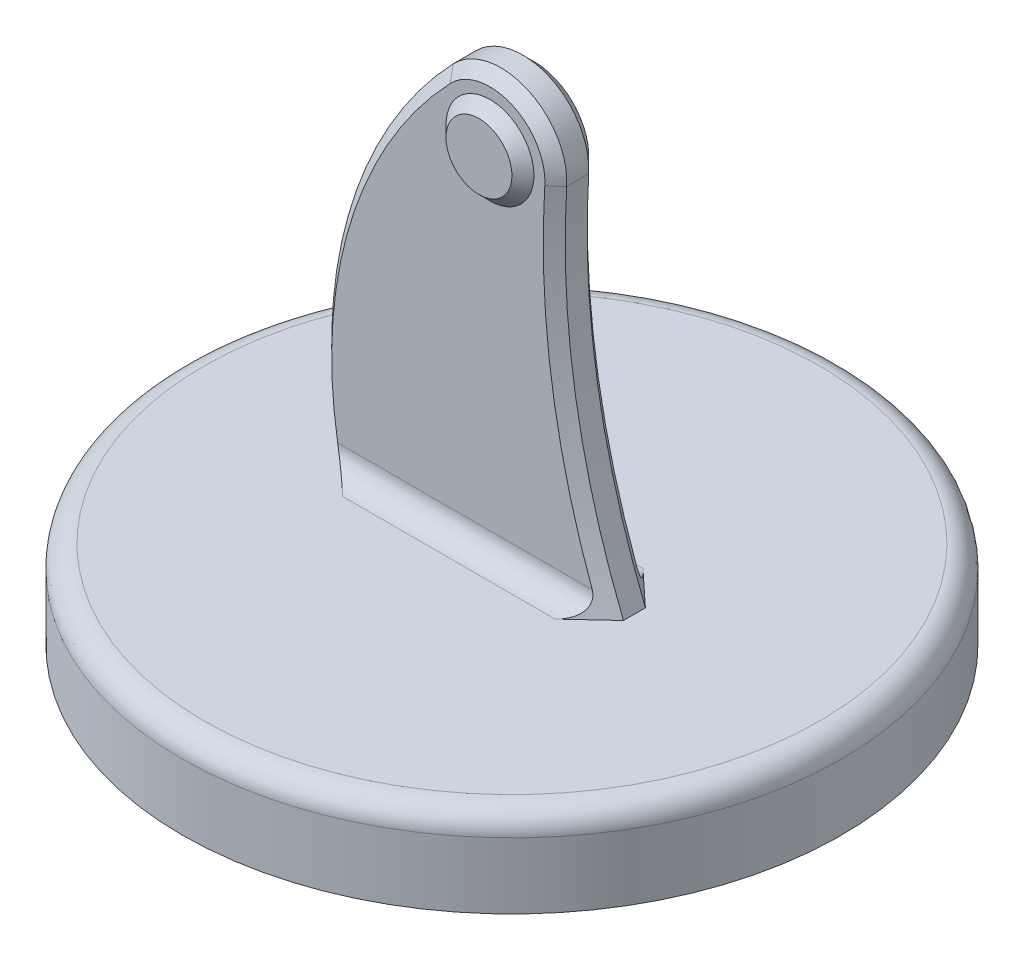
ISO-10303-21;
HEADER;
FILE_DESCRIPTION(('STEP AP214'),'2;1');
FILE_NAME('part.step','',(''),(''),'','','');
FILE_SCHEMA(('AUTOMOTIVE_DESIGN { 1 0 10303 214 1 1 1 1 }'));
ENDSEC;
DATA;
#1=APPLICATION_CONTEXT('core data for automotive mechanical design processes');
#2=APPLICATION_PROTOCOL_DEFINITION('international standard','automotive_design',2000,#1);
#3=PRODUCT_CONTEXT('',#1,'mechanical');
#4=PRODUCT('Part','Part','',(#3));
#5=PRODUCT_RELATED_PRODUCT_CATEGORY('part','',(#4));
#6=PRODUCT_DEFINITION_FORMATION('','',#4);
#7=PRODUCT_DEFINITION_CONTEXT('part definition',#1,'design');
#8=PRODUCT_DEFINITION('design','',#6,#7);
#9=PRODUCT_DEFINITION_SHAPE('','',#8);
#10=(LENGTH_UNIT() NAMED_UNIT(*) SI_UNIT(.MILLI.,.METRE.));
#11=(NAMED_UNIT(*) PLANE_ANGLE_UNIT() SI_UNIT($,.RADIAN.));
#12=(NAMED_UNIT(*) SI_UNIT($,.STERADIAN.) SOLID_ANGLE_UNIT());
#13=UNCERTAINTY_MEASURE_WITH_UNIT(LENGTH_MEASURE(1.E-05),#10,'distance_accuracy_value','');
#14=(GEOMETRIC_REPRESENTATION_CONTEXT(3) GLOBAL_UNCERTAINTY_ASSIGNED_CONTEXT((#13)) GLOBAL_UNIT_ASSIGNED_CONTEXT((#10,
#11,#12)) REPRESENTATION_CONTEXT('',''));
#15=CARTESIAN_POINT('',(0.,0.,0.));
#16=DIRECTION('',(0.,0.,1.));
#17=DIRECTION('',(1.,0.,0.));
#18=AXIS2_PLACEMENT_3D('',#15,#16,#17);
#19=CARTESIAN_POINT('',(0.,20.,0.));
#20=DIRECTION('',(0.,1.,0.));
#21=DIRECTION('',(0.,0.,1.));
#22=AXIS2_PLACEMENT_3D('',#19,#20,#21);
#23=PLANE('',#22);
#24=CARTESIAN_POINT('',(0.,20.,0.));
#25=DIRECTION('',(0.,1.,0.));
#26=DIRECTION('',(0.,0.,1.));
#27=AXIS2_PLACEMENT_3D('',#24,#25,#26);
#28=CIRCLE('',#27,70.);
#29=CARTESIAN_POINT('',(0.,20.,70.));
#30=VERTEX_POINT('',#29);
#31=EDGE_CURVE('E340',#30,#30,#28,.T.);
#32=ORIENTED_EDGE('',*,*,#31,.T.);
#33=EDGE_LOOP('',(#32));
#34=FACE_BOUND('',#33,.T.);
#35=DIRECTION('',(-1.,0.,0.));
#36=VECTOR('',#35,1.);
#37=CARTESIAN_POINT('',(0.,20.,10.));
#38=LINE('',#37,#36);
#39=CARTESIAN_POINT('',(19.8084097202195,20.,10.));
#40=VERTEX_POINT('',#39);
#41=CARTESIAN_POINT('',(-28.5347400447897,20.,10.));
#42=VERTEX_POINT('',#41);
#43=EDGE_CURVE('E303',#40,#42,#38,.T.);
#44=ORIENTED_EDGE('',*,*,#43,.T.);
#45=CARTESIAN_POINT('',(-28.5347400447897,20.,9.99999999999999));
#46=CARTESIAN_POINT('',(-29.3904619495379,20.,9.1672779060872));
#47=CARTESIAN_POINT('',(-30.2458713230867,20.,8.33423473892486));
#48=CARTESIAN_POINT('',(-31.9561089872226,20.,6.6675526869515));
#49=CARTESIAN_POINT('',(-32.8109372780003,20.,5.83391380233608));
#50=CARTESIAN_POINT('',(-34.5191891841924,20.,4.16693335697089));
#51=CARTESIAN_POINT('',(-35.372613344394,20.,3.33359235450618));
#52=CARTESIAN_POINT('',(-36.2257918410724,20.,2.49999999999994));
#53=B_SPLINE_CURVE_WITH_KNOTS('',3,(#45,#46,#47,#48,#49,#50,#51,#52),.UNSPECIFIED.,.F.,.F.,(4,2,
2,4),(0.,3.58206271115793,7.16412424671795,10.7425468249187),.UNSPECIFIED.);
#54=CARTESIAN_POINT('',(-36.2257918410724,20.,2.49999999999994));
#55=VERTEX_POINT('',#54);
#56=EDGE_CURVE('E203',#42,#55,#53,.T.);
#57=ORIENTED_EDGE('',*,*,#56,.T.);
#58=DIRECTION('',(0.,0.,-1.));
#59=VECTOR('',#58,1.);
#60=CARTESIAN_POINT('',(-36.2257918410724,20.,5.));
#61=LINE('',#60,#59);
#62=CARTESIAN_POINT('',(-36.2257918410724,20.,-2.5));
#63=VERTEX_POINT('',#62);
#64=EDGE_CURVE('E158',#55,#63,#61,.T.);
#65=ORIENTED_EDGE('',*,*,#64,.T.);
#66=CARTESIAN_POINT('',(-36.2257918410724,20.,-2.5));
#67=CARTESIAN_POINT('',(-35.372613344394,20.,-3.33359235450621));
#68=CARTESIAN_POINT('',(-34.5191891841924,20.,-4.16693335697091));
#69=CARTESIAN_POINT('',(-32.810937278002,20.,-5.83391380233447));
#70=CARTESIAN_POINT('',(-31.9561089872259,20.,-6.66755268694829));
#71=CARTESIAN_POINT('',(-30.2458713230933,20.,-8.33423473891845));
#72=CARTESIAN_POINT('',(-29.3904619495461,20.,-9.16727790607919));
#73=CARTESIAN_POINT('',(-28.5347400447996,20.,-9.99999999999037));
#74=B_SPLINE_CURVE_WITH_KNOTS('',3,(#66,#67,#68,#69,#70,#71,#72,#73),.UNSPECIFIED.,.F.,.F.,(4,2,
2,4),(0.,3.57842257820069,7.16048411375383,10.7425468249049),.UNSPECIFIED.);
#75=CARTESIAN_POINT('',(-28.5347400447996,20.,-10.));
#76=VERTEX_POINT('',#75);
#77=EDGE_CURVE('E235',#63,#76,#74,.T.);
#78=ORIENTED_EDGE('',*,*,#77,.T.);
#79=DIRECTION('',(-1.,0.,0.));
#80=VECTOR('',#79,1.);
#81=CARTESIAN_POINT('',(25.1824752050036,20.,-10.));
#82=LINE('',#81,#80);
#83=CARTESIAN_POINT('',(19.8084097202196,20.,-10.));
#84=VERTEX_POINT('',#83);
#85=EDGE_CURVE('E309',#76,#84,#82,.F.);
#86=ORIENTED_EDGE('',*,*,#85,.T.);
#87=CARTESIAN_POINT('',(19.8084097202196,20.,-10.));
#88=CARTESIAN_POINT('',(20.7032286114694,20.,-9.16574365323036));
#89=CARTESIAN_POINT('',(21.5984643871197,20.,-8.33193432974239));
#90=CARTESIAN_POINT('',(23.3898068938444,20.,-6.6652533617684));
#91=CARTESIAN_POINT('',(24.2859136241593,20.,-5.83238171646611));
#92=CARTESIAN_POINT('',(26.0805990637617,20.,-4.16616784041949));
#93=CARTESIAN_POINT('',(26.979179359604,20.,-3.33282731858594));
#94=CARTESIAN_POINT('',(27.8782351753599,20.,-2.5));
#95=B_SPLINE_CURVE_WITH_KNOTS('',3,(#87,#88,#89,#90,#91,#92,#93,#94),.UNSPECIFIED.,.F.,.F.,(4,2,
2,4),(0.,3.67017170974666,7.34034022201679,11.0169040821688),.UNSPECIFIED.);
#96=CARTESIAN_POINT('',(27.8782351753599,20.,-2.5));
#97=VERTEX_POINT('',#96);
#98=EDGE_CURVE('E228',#84,#97,#95,.T.);
#99=ORIENTED_EDGE('',*,*,#98,.T.);
#100=DIRECTION('',(0.,0.,-1.));
#101=VECTOR('',#100,1.);
#102=CARTESIAN_POINT('',(27.8782351753599,20.,5.));
#103=LINE('',#102,#101);
#104=CARTESIAN_POINT('',(27.8782351753599,20.,2.49999999999994));
#105=VERTEX_POINT('',#104);
#106=EDGE_CURVE('E164',#97,#105,#103,.F.);
#107=ORIENTED_EDGE('',*,*,#106,.T.);
#108=CARTESIAN_POINT('',(27.8782351753599,20.,2.49999999999994));
#109=CARTESIAN_POINT('',(26.979179359604,20.,3.33282731858591));
#110=CARTESIAN_POINT('',(26.0805990637617,20.,4.16616784041948));
#111=CARTESIAN_POINT('',(24.2859136241593,20.,5.83238171646611));
#112=CARTESIAN_POINT('',(23.3898068938443,20.,6.6652533617684));
#113=CARTESIAN_POINT('',(21.5984643871197,20.,8.33193432974239));
#114=CARTESIAN_POINT('',(20.7032286114694,20.,9.16574365323037));
#115=CARTESIAN_POINT('',(19.8084097202195,20.,10.));
#116=B_SPLINE_CURVE_WITH_KNOTS('',3,(#108,#109,#110,#111,#112,#113,#114,#115),.UNSPECIFIED.,.F.,
.F.,(4,2,2,4),(0.,3.67656386015208,7.34673237242222,11.0169040821689),.UNSPECIFIED.);
#117=EDGE_CURVE('E194',#105,#40,#116,.T.);
#118=ORIENTED_EDGE('',*,*,#117,.T.);
#119=EDGE_LOOP('',(#44,#57,#65,#78,#86,#99,#107,#118));
#120=FACE_BOUND('',#119,.T.);
#121=ADVANCED_FACE('F45',(#34,#120),#23,.T.);
#122=CARTESIAN_POINT('',(0.,20.,0.));
#123=DIRECTION('',(0.,-1.,0.));
#124=DIRECTION('',(0.,0.,-1.));
#125=AXIS2_PLACEMENT_3D('',#122,#123,#124);
#126=CYLINDRICAL_SURFACE('',#125,75.);
#127=CARTESIAN_POINT('',(0.,15.,0.));
#128=DIRECTION('',(0.,1.,0.));
#129=DIRECTION('',(0.,0.,1.));
#130=AXIS2_PLACEMENT_3D('',#127,#128,#129);
#131=CIRCLE('',#130,75.);
#132=CARTESIAN_POINT('',(0.,15.,75.));
#133=VERTEX_POINT('',#132);
#134=EDGE_CURVE('E344',#133,#133,#131,.F.);
#135=ORIENTED_EDGE('',*,*,#134,.T.);
#136=EDGE_LOOP('',(#135));
#137=FACE_BOUND('',#136,.T.);
#138=CARTESIAN_POINT('',(0.,0.,0.));
#139=DIRECTION('',(0.,1.,0.));
#140=DIRECTION('',(0.,0.,1.));
#141=AXIS2_PLACEMENT_3D('',#138,#139,#140);
#142=CIRCLE('',#141,75.);
#143=CARTESIAN_POINT('',(0.,0.,75.));
#144=VERTEX_POINT('',#143);
#145=EDGE_CURVE('E331',#144,#144,#142,.T.);
#146=ORIENTED_EDGE('',*,*,#145,.T.);
#147=EDGE_LOOP('',(#146));
#148=FACE_BOUND('',#147,.T.);
#149=ADVANCED_FACE('F218',(#137,#148),#126,.T.);
#150=CARTESIAN_POINT('',(0.,0.,0.));
#151=DIRECTION('',(0.,1.,0.));
#152=DIRECTION('',(0.,0.,1.));
#153=AXIS2_PLACEMENT_3D('',#150,#151,#152);
#154=PLANE('',#153);
#155=ORIENTED_EDGE('',*,*,#145,.F.);
#156=EDGE_LOOP('',(#155));
#157=FACE_BOUND('',#156,.T.);
#158=ADVANCED_FACE('F222',(#157),#154,.F.);
#159=CARTESIAN_POINT('',(0.,15.,0.));
#160=DIRECTION('',(0.,1.,0.));
#161=DIRECTION('',(0.,0.,1.));
#162=AXIS2_PLACEMENT_3D('',#159,#160,#161);
#163=TOROIDAL_SURFACE('',#162,70.,5.);
#164=ORIENTED_EDGE('',*,*,#134,.F.);
#165=EDGE_LOOP('',(#164));
#166=FACE_BOUND('',#165,.T.);
#167=ORIENTED_EDGE('',*,*,#31,.F.);
#168=EDGE_LOOP('',(#167));
#169=FACE_BOUND('',#168,.T.);
#170=ADVANCED_FACE('F386',(#166,#169),#163,.T.);
#171=CARTESIAN_POINT('',(61.4788080980091,41.3028437243492,5.));
#172=DIRECTION('',(0.,0.,-1.));
#173=DIRECTION('',(-1.,0.,0.));
#174=AXIS2_PLACEMENT_3D('',#171,#172,#173);
#175=CYLINDRICAL_SURFACE('',#174,100.);
#176=ORIENTED_EDGE('',*,*,#64,.F.);
#177=CARTESIAN_POINT('',(61.4788080980091,41.3028437243492,2.49999999999994));
#178=DIRECTION('',(0.,0.,-1.));
#179=DIRECTION('',(-1.,0.,0.));
#180=AXIS2_PLACEMENT_3D('',#177,#178,#179);
#181=CIRCLE('',#180,100.);
#182=CARTESIAN_POINT('',(-10.8492014290605,110.358321695703,2.49999999999994));
#183=VERTEX_POINT('',#182);
#184=EDGE_CURVE('E176',#55,#183,#181,.T.);
#185=ORIENTED_EDGE('',*,*,#184,.T.);
#186=DIRECTION('',(0.,0.,-1.));
#187=VECTOR('',#186,1.);
#188=CARTESIAN_POINT('',(-10.8492014290605,110.358321695703,5.));
#189=LINE('',#188,#187);
#190=CARTESIAN_POINT('',(-10.8492014290605,110.358321695703,-2.5));
#191=VERTEX_POINT('',#190);
#192=EDGE_CURVE('E321',#183,#191,#189,.T.);
#193=ORIENTED_EDGE('',*,*,#192,.T.);
#194=CARTESIAN_POINT('',(61.4788080980091,41.3028437243492,-2.5));
#195=DIRECTION('',(0.,0.,-1.));
#196=DIRECTION('',(-1.,0.,0.));
#197=AXIS2_PLACEMENT_3D('',#194,#195,#196);
#198=CIRCLE('',#197,100.);
#199=EDGE_CURVE('E173',#191,#63,#198,.F.);
#200=ORIENTED_EDGE('',*,*,#199,.T.);
#201=EDGE_LOOP('',(#176,#185,#193,#200));
#202=FACE_BOUND('',#201,.T.);
#203=ADVANCED_FACE('F220',(#202),#175,.T.);
#204=CARTESIAN_POINT('',(194.618391581677,87.8064911464742,5.));
#205=DIRECTION('',(0.,0.,-1.));
#206=DIRECTION('',(-1.,0.,0.));
#207=AXIS2_PLACEMENT_3D('',#204,#205,#206);
#208=CYLINDRICAL_SURFACE('',#207,180.);
#209=DIRECTION('',(0.,0.,-1.));
#210=VECTOR('',#209,1.);
#211=CARTESIAN_POINT('',(14.9706455062829,99.062037780498,5.));
#212=LINE('',#211,#210);
#213=CARTESIAN_POINT('',(14.9706455062829,99.062037780498,2.49999999999994));
#214=VERTEX_POINT('',#213);
#215=CARTESIAN_POINT('',(14.9706455062829,99.062037780498,-2.5));
#216=VERTEX_POINT('',#215);
#217=EDGE_CURVE('E324',#214,#216,#212,.T.);
#218=ORIENTED_EDGE('',*,*,#217,.F.);
#219=CARTESIAN_POINT('',(194.618391581677,87.8064911464742,2.49999999999994));
#220=DIRECTION('',(0.,0.,-1.));
#221=DIRECTION('',(-1.,0.,0.));
#222=AXIS2_PLACEMENT_3D('',#219,#220,#221);
#223=CIRCLE('',#222,180.);
#224=EDGE_CURVE('E147',#214,#105,#223,.F.);
#225=ORIENTED_EDGE('',*,*,#224,.T.);
#226=ORIENTED_EDGE('',*,*,#106,.F.);
#227=CARTESIAN_POINT('',(194.618391581677,87.8064911464742,-2.5));
#228=DIRECTION('',(0.,0.,-1.));
#229=DIRECTION('',(-1.,0.,0.));
#230=AXIS2_PLACEMENT_3D('',#227,#228,#229);
#231=CIRCLE('',#230,180.);
#232=EDGE_CURVE('E139',#97,#216,#231,.T.);
#233=ORIENTED_EDGE('',*,*,#232,.T.);
#234=EDGE_LOOP('',(#218,#225,#226,#233));
#235=FACE_BOUND('',#234,.T.);
#236=ADVANCED_FACE('F354',(#235),#208,.F.);
#237=CARTESIAN_POINT('',(0.,100.,5.));
#238=DIRECTION('',(0.,0.,-1.));
#239=DIRECTION('',(-1.,0.,0.));
#240=AXIS2_PLACEMENT_3D('',#237,#238,#239);
#241=CYLINDRICAL_SURFACE('',#240,15.);
#242=ORIENTED_EDGE('',*,*,#192,.F.);
#243=CARTESIAN_POINT('',(0.,100.,2.49999999999994));
#244=DIRECTION('',(0.,0.,-1.));
#245=DIRECTION('',(-1.,0.,0.));
#246=AXIS2_PLACEMENT_3D('',#243,#244,#245);
#247=CIRCLE('',#246,15.);
#248=EDGE_CURVE('E182',#183,#214,#247,.T.);
#249=ORIENTED_EDGE('',*,*,#248,.T.);
#250=ORIENTED_EDGE('',*,*,#217,.T.);
#251=CARTESIAN_POINT('',(0.,100.,-2.5));
#252=DIRECTION('',(0.,0.,-1.));
#253=DIRECTION('',(-1.,0.,0.));
#254=AXIS2_PLACEMENT_3D('',#251,#252,#253);
#255=CIRCLE('',#254,15.);
#256=EDGE_CURVE('E179',#216,#191,#255,.F.);
#257=ORIENTED_EDGE('',*,*,#256,.T.);
#258=EDGE_LOOP('',(#242,#249,#250,#257));
#259=FACE_BOUND('',#258,.T.);
#260=ADVANCED_FACE('F361',(#259),#241,.T.);
#261=CARTESIAN_POINT('',(61.4788080980091,41.3028437243492,5.));
#262=DIRECTION('',(0.,0.,-1.));
#263=DIRECTION('',(-1.,0.,0.));
#264=AXIS2_PLACEMENT_3D('',#261,#262,#263);
#265=PLANE('',#264);
#266=CARTESIAN_POINT('',(0.,100.,5.));
#267=DIRECTION('',(0.,0.,-1.));
#268=DIRECTION('',(-1.,0.,0.));
#269=AXIS2_PLACEMENT_3D('',#266,#267,#268);
#270=CIRCLE('',#269,10.);
#271=CARTESIAN_POINT('',(-10.,100.,5.));
#272=VERTEX_POINT('',#271);
#273=EDGE_CURVE('E55',#272,#272,#270,.F.);
#274=ORIENTED_EDGE('',*,*,#273,.F.);
#275=EDGE_LOOP('',(#274));
#276=FACE_BOUND('',#275,.T.);
#277=CARTESIAN_POINT('',(61.4788080980091,41.3028437243492,5.));
#278=DIRECTION('',(0.,0.,-1.));
#279=DIRECTION('',(-1.,0.,0.));
#280=AXIS2_PLACEMENT_3D('',#277,#278,#279);
#281=CIRCLE('',#280,97.5);
#282=CARTESIAN_POINT('',(-9.04100119088368,108.631934746419,5.));
#283=VERTEX_POINT('',#282);
#284=CARTESIAN_POINT('',(-34.6485412178825,25.,5.));
#285=VERTEX_POINT('',#284);
#286=EDGE_CURVE('E140',#283,#285,#281,.F.);
#287=ORIENTED_EDGE('',*,*,#286,.T.);
#288=DIRECTION('',(-1.,0.,0.));
#289=VECTOR('',#288,1.);
#290=CARTESIAN_POINT('',(61.4788080980091,25.,5.));
#291=LINE('',#290,#289);
#292=CARTESIAN_POINT('',(23.2661384016624,25.,5.));
#293=VERTEX_POINT('',#292);
#294=EDGE_CURVE('E134',#285,#293,#291,.F.);
#295=ORIENTED_EDGE('',*,*,#294,.T.);
#296=CARTESIAN_POINT('',(194.618391581677,87.8064911464742,5.));
#297=DIRECTION('',(0.,0.,-1.));
#298=DIRECTION('',(-1.,0.,0.));
#299=AXIS2_PLACEMENT_3D('',#296,#297,#298);
#300=CIRCLE('',#299,182.5);
#301=CARTESIAN_POINT('',(12.4755379219024,99.2183648170816,5.));
#302=VERTEX_POINT('',#301);
#303=EDGE_CURVE('E126',#293,#302,#300,.T.);
#304=ORIENTED_EDGE('',*,*,#303,.T.);
#305=CARTESIAN_POINT('',(0.,100.,5.));
#306=DIRECTION('',(0.,0.,-1.));
#307=DIRECTION('',(-1.,0.,0.));
#308=AXIS2_PLACEMENT_3D('',#305,#306,#307);
#309=CIRCLE('',#308,12.5);
#310=EDGE_CURVE('E131',#302,#283,#309,.F.);
#311=ORIENTED_EDGE('',*,*,#310,.T.);
#312=EDGE_LOOP('',(#287,#295,#304,#311));
#313=FACE_BOUND('',#312,.T.);
#314=ADVANCED_FACE('F129',(#276,#313),#265,.F.);
#315=CARTESIAN_POINT('',(61.4788080980091,41.3028437243492,-5.));
#316=DIRECTION('',(0.,0.,-1.));
#317=DIRECTION('',(-1.,0.,0.));
#318=AXIS2_PLACEMENT_3D('',#315,#316,#317);
#319=PLANE('',#318);
#320=CARTESIAN_POINT('',(0.,100.,-5.));
#321=DIRECTION('',(0.,0.,-1.));
#322=DIRECTION('',(-1.,0.,0.));
#323=AXIS2_PLACEMENT_3D('',#320,#321,#322);
#324=CIRCLE('',#323,5.);
#325=CARTESIAN_POINT('',(-5.,100.,-5.));
#326=VERTEX_POINT('',#325);
#327=EDGE_CURVE('E334',#326,#326,#324,.T.);
#328=ORIENTED_EDGE('',*,*,#327,.F.);
#329=EDGE_LOOP('',(#328));
#330=FACE_BOUND('',#329,.T.);
#331=CARTESIAN_POINT('',(194.618391581677,87.8064911464742,-5.));
#332=DIRECTION('',(0.,0.,-1.));
#333=DIRECTION('',(-1.,0.,0.));
#334=AXIS2_PLACEMENT_3D('',#331,#332,#333);
#335=CIRCLE('',#334,182.5);
#336=CARTESIAN_POINT('',(12.4755379219024,99.2183648170816,-5.));
#337=VERTEX_POINT('',#336);
#338=CARTESIAN_POINT('',(23.2661384016624,25.,-5.));
#339=VERTEX_POINT('',#338);
#340=EDGE_CURVE('E191',#337,#339,#335,.F.);
#341=ORIENTED_EDGE('',*,*,#340,.T.);
#342=DIRECTION('',(-1.,0.,0.));
#343=VECTOR('',#342,1.);
#344=CARTESIAN_POINT('',(-33.6654972978261,25.,-5.));
#345=LINE('',#344,#343);
#346=CARTESIAN_POINT('',(-34.6485412178826,25.,-5.));
#347=VERTEX_POINT('',#346);
#348=EDGE_CURVE('E296',#339,#347,#345,.T.);
#349=ORIENTED_EDGE('',*,*,#348,.T.);
#350=CARTESIAN_POINT('',(61.4788080980091,41.3028437243492,-5.));
#351=DIRECTION('',(0.,0.,-1.));
#352=DIRECTION('',(-1.,0.,0.));
#353=AXIS2_PLACEMENT_3D('',#350,#351,#352);
#354=CIRCLE('',#353,97.5);
#355=CARTESIAN_POINT('',(-9.0410011908837,108.631934746419,-5.));
#356=VERTEX_POINT('',#355);
#357=EDGE_CURVE('E185',#347,#356,#354,.T.);
#358=ORIENTED_EDGE('',*,*,#357,.T.);
#359=CARTESIAN_POINT('',(0.,100.,-5.));
#360=DIRECTION('',(0.,0.,-1.));
#361=DIRECTION('',(-1.,0.,0.));
#362=AXIS2_PLACEMENT_3D('',#359,#360,#361);
#363=CIRCLE('',#362,12.5);
#364=EDGE_CURVE('E188',#356,#337,#363,.T.);
#365=ORIENTED_EDGE('',*,*,#364,.T.);
#366=EDGE_LOOP('',(#341,#349,#358,#365));
#367=FACE_BOUND('',#366,.T.);
#368=ADVANCED_FACE('F368',(#330,#367),#319,.T.);
#369=CARTESIAN_POINT('',(61.4788080980091,41.3028437243492,5.));
#370=DIRECTION('',(0.,0.,-1.));
#371=DIRECTION('',(-1.,0.,0.));
#372=AXIS2_PLACEMENT_3D('',#369,#370,#371);
#373=CONICAL_SURFACE('',#372,97.5,0.785398163397443);
#374=ORIENTED_EDGE('',*,*,#56,.F.);
#375=CARTESIAN_POINT('',(-28.5347400447897,20.,10.));
#376=CARTESIAN_POINT('',(-28.6394037298975,20.000005434771,9.89815059591553));
#377=CARTESIAN_POINT('',(-28.7444044701097,20.0031117141702,9.79667872726323));
#378=CARTESIAN_POINT('',(-28.9548959740975,20.015430758412,9.59462953884507));
#379=CARTESIAN_POINT('',(-29.06038670815,20.0246431575365,9.49405216587014));
#380=CARTESIAN_POINT('',(-29.3774210581305,20.0613070700192,9.19377282554195));
#381=CARTESIAN_POINT('',(-29.5894429565536,20.0977851443199,8.99560518423251));
#382=CARTESIAN_POINT('',(-30.0149470348641,20.1948303369437,8.60300164617535));
#383=CARTESIAN_POINT('',(-30.2284255574994,20.2556075268316,8.40861421626865));
#384=CARTESIAN_POINT('',(-30.6533009098754,20.4012836398836,8.02679361368094));
#385=CARTESIAN_POINT('',(-30.8646984190369,20.486174400497,7.83935811197359));
#386=CARTESIAN_POINT('',(-31.2358180513899,20.6583962515183,7.51482560986986));
#387=CARTESIAN_POINT('',(-31.3963375276233,20.7407622681903,7.37599142315452));
#388=CARTESIAN_POINT('',(-31.7140120771384,20.920552010497,7.10437811445689));
#389=CARTESIAN_POINT('',(-31.8711678474207,21.0179725815724,6.97159773148074));
#390=CARTESIAN_POINT('',(-32.1804856522051,21.2281280967814,6.71357483416337));
#391=CARTESIAN_POINT('',(-32.3326604747659,21.340819251485,6.58831219251085));
#392=CARTESIAN_POINT('',(-32.6308687242772,21.5823060586908,6.34643164579909));
#393=CARTESIAN_POINT('',(-32.7769045910204,21.7110952309635,6.22981029212435));
#394=CARTESIAN_POINT('',(-33.1114401131507,22.0342782323158,5.96739519381318));
#395=CARTESIAN_POINT('',(-33.2966353855766,22.2357416578196,5.82592043060814));
#396=CARTESIAN_POINT('',(-33.6456704142065,22.6710303913349,5.5683239835165));
#397=CARTESIAN_POINT('',(-33.8095301722191,22.9048249589202,5.45217848375558));
#398=CARTESIAN_POINT('',(-34.0707148956103,23.3443131711605,5.27769119806797));
#399=CARTESIAN_POINT('',(-34.1745553911898,23.5431850809405,5.21216424392805));
#400=CARTESIAN_POINT('',(-34.3129103192239,23.8535368517304,5.13204069721148));
#401=CARTESIAN_POINT('',(-34.3560939901829,23.9588861391615,5.10837492195165));
#402=CARTESIAN_POINT('',(-34.4360284136755,24.1732140859586,5.06762637880011));
#403=CARTESIAN_POINT('',(-34.4727823057824,24.2821909429161,5.05054039316327));
#404=CARTESIAN_POINT('',(-34.535756379972,24.4918108462674,5.02489103654147));
#405=CARTESIAN_POINT('',(-34.5626708259066,24.5921598661022,5.01563242611837));
#406=CARTESIAN_POINT('',(-34.6103490298529,24.7948018697914,5.00317605161259));
#407=CARTESIAN_POINT('',(-34.6311052843733,24.8970970648735,4.99998565599897));
#408=CARTESIAN_POINT('',(-34.6485412178825,25.,5.));
#409=B_SPLINE_CURVE_WITH_KNOTS('',3,(#375,#376,#377,#378,#379,#380,#381,#382,#383,#384,#385,
#386,#387,#388,#389,#390,#391,#392,#393,#394,#395,#396,#397,#398,#399,#400,#401,#402,#403,#404,
#405,#406,#407,#408),.UNSPECIFIED.,.F.,.F.,(4,2,2,2,2,2,2,2,2,2,2,2,2,2,2,2,4),(0.,
0.438046358396577,0.876066482945869,1.7524565435902,2.63659295844549,3.52043044513257,
4.20284499036563,4.88511673460729,5.5654718630622,6.24555399245983,7.1667857113255,
8.08714747013587,8.78553853656554,9.13405477040997,9.48240035064392,9.79495848648627,
10.1078959115209),.UNSPECIFIED.);
#410=EDGE_CURVE('E281',#42,#285,#409,.T.);
#411=ORIENTED_EDGE('',*,*,#410,.T.);
#412=ORIENTED_EDGE('',*,*,#286,.F.);
#413=DIRECTION('',(0.511436260063155,-0.488295967516219,0.707106781186556));
#414=VECTOR('',#413,1.);
#415=CARTESIAN_POINT('',(-10.8492014290604,110.358321695703,2.49999999999994));
#416=LINE('',#415,#414);
#417=EDGE_CURVE('E151',#183,#283,#416,.T.);
#418=ORIENTED_EDGE('',*,*,#417,.F.);
#419=ORIENTED_EDGE('',*,*,#184,.F.);
#420=EDGE_LOOP('',(#374,#411,#412,#418,#419));
#421=FACE_BOUND('',#420,.T.);
#422=ADVANCED_FACE('F252',(#421),#373,.T.);
#423=CARTESIAN_POINT('',(0.,100.,5.));
#424=DIRECTION('',(0.,0.,-1.));
#425=DIRECTION('',(-1.,0.,0.));
#426=AXIS2_PLACEMENT_3D('',#423,#424,#425);
#427=CONICAL_SURFACE('',#426,12.5,0.785398163397445);
#428=ORIENTED_EDGE('',*,*,#417,.T.);
#429=ORIENTED_EDGE('',*,*,#310,.F.);
#430=DIRECTION('',(-0.705722997082166,0.0442159630604418,0.70710678118655));
#431=VECTOR('',#430,1.);
#432=CARTESIAN_POINT('',(14.9706455062829,99.062037780498,2.49999999999994));
#433=LINE('',#432,#431);
#434=EDGE_CURVE('E144',#214,#302,#433,.T.);
#435=ORIENTED_EDGE('',*,*,#434,.F.);
#436=ORIENTED_EDGE('',*,*,#248,.F.);
#437=EDGE_LOOP('',(#428,#429,#435,#436));
#438=FACE_BOUND('',#437,.T.);
#439=ADVANCED_FACE('F155',(#438),#427,.T.);
#440=CARTESIAN_POINT('',(194.618391581677,87.8064911464742,5.));
#441=DIRECTION('',(0.,0.,1.));
#442=DIRECTION('',(1.,0.,0.));
#443=AXIS2_PLACEMENT_3D('',#440,#441,#442);
#444=CONICAL_SURFACE('',#443,182.5,0.785398163397448);
#445=ORIENTED_EDGE('',*,*,#117,.F.);
#446=ORIENTED_EDGE('',*,*,#224,.F.);
#447=ORIENTED_EDGE('',*,*,#434,.T.);
#448=ORIENTED_EDGE('',*,*,#303,.F.);
#449=CARTESIAN_POINT('',(23.2661384016624,25.,5.));
#450=CARTESIAN_POINT('',(23.3002005671833,24.9070970588888,4.99998982101167));
#451=CARTESIAN_POINT('',(23.3319003658589,24.8132947634358,5.00258916549921));
#452=CARTESIAN_POINT('',(23.3901604515582,24.6243431264429,5.01323591479231));
#453=CARTESIAN_POINT('',(23.4167170425787,24.5291928685387,5.02128721893148));
#454=CARTESIAN_POINT('',(23.4642590261444,24.3379983044757,5.04308274610182));
#455=CARTESIAN_POINT('',(23.4852365999852,24.2419529368185,5.05683489026829));
#456=CARTESIAN_POINT('',(23.5211837982653,24.0497650147842,5.09015681555102));
#457=CARTESIAN_POINT('',(23.5361548951619,23.9536224900254,5.10972516880294));
#458=CARTESIAN_POINT('',(23.5598434730769,23.7615087850931,5.15480488443815));
#459=CARTESIAN_POINT('',(23.5685335526405,23.6655401561134,5.18034165170114));
#460=CARTESIAN_POINT('',(23.579358971121,23.4749236099918,5.23722376580067));
#461=CARTESIAN_POINT('',(23.5814919758389,23.3802761751035,5.26857117691084));
#462=CARTESIAN_POINT('',(23.5791344482645,23.1932936963799,5.33677201100208));
#463=CARTESIAN_POINT('',(23.5746576512134,23.1009542616796,5.37361387353918));
#464=CARTESIAN_POINT('',(23.5591775223305,22.919061246429,5.45252524641229));
#465=CARTESIAN_POINT('',(23.5481717304809,22.8295087293356,5.49459672245526));
#466=CARTESIAN_POINT('',(23.520532895729,22.6581681393704,5.58133674973435));
#467=CARTESIAN_POINT('',(23.5042028834637,22.5762147571267,5.62577615786903));
#468=CARTESIAN_POINT('',(23.466096025912,22.4158463901558,5.71855815688245));
#469=CARTESIAN_POINT('',(23.444317399856,22.3374325721739,5.76690202034877));
#470=CARTESIAN_POINT('',(23.3712669897884,22.1079558946016,5.91717329223245));
#471=CARTESIAN_POINT('',(23.3122859316015,21.9626892734793,6.02432427062643));
#472=CARTESIAN_POINT('',(23.151924605642,21.6389242665395,6.29030441266747));
#473=CARTESIAN_POINT('',(23.0429297160745,21.4679275550975,6.45361876347933));
#474=CARTESIAN_POINT('',(22.8002588719763,21.1580788280493,6.79181102146745));
#475=CARTESIAN_POINT('',(22.6665421365392,21.0192807927284,6.96670772427775));
#476=CARTESIAN_POINT('',(22.319763824735,20.7186526437609,7.39885475877629));
#477=CARTESIAN_POINT('',(22.0972299147782,20.5723698914755,7.65932857124398));
#478=CARTESIAN_POINT('',(21.7458214725293,20.3928428518393,8.05194856088024));
#479=CARTESIAN_POINT('',(21.6254999159944,20.3395856596789,8.18339715955419));
#480=CARTESIAN_POINT('',(21.380034828669,20.2454846645251,8.44627656448095));
#481=CARTESIAN_POINT('',(21.2548922835545,20.2046383390843,8.57770736891519));
#482=CARTESIAN_POINT('',(21.0216039690425,20.1402893934769,8.81843555286566));
#483=CARTESIAN_POINT('',(20.9140295433623,20.115042165326,8.92783397103434));
#484=CARTESIAN_POINT('',(20.6966536902156,20.0722321318853,9.14592246129715));
#485=CARTESIAN_POINT('',(20.5868522553934,20.0546693519809,9.25461253105011));
#486=CARTESIAN_POINT('',(20.3664141647906,20.0269838470988,9.47008454014683));
#487=CARTESIAN_POINT('',(20.2557937252113,20.0167960789621,9.57687485159776));
#488=CARTESIAN_POINT('',(20.0331107499653,20.0033093732439,9.78932326315866));
#489=CARTESIAN_POINT('',(19.9210486204085,20.0000085366556,9.89498166738485));
#490=CARTESIAN_POINT('',(19.8084097202195,20.,10.));
#491=B_SPLINE_CURVE_WITH_KNOTS('',3,(#449,#450,#451,#452,#453,#454,#455,#456,#457,#458,#459,
#460,#461,#462,#463,#464,#465,#466,#467,#468,#469,#470,#471,#472,#473,#474,#475,#476,#477,#478,
#479,#480,#481,#482,#483,#484,#485,#486,#487,#488,#489,#490),.UNSPECIFIED.,.F.,.F.,(4,2,2,2,2,2,
2,2,2,2,2,2,2,2,2,2,2,2,2,2,4),(0.,0.296831377796508,0.593875278954075,0.891333303938968,
1.18871836397785,1.48739308625392,1.78617411897319,2.08433515458883,2.3826086037972,
2.66622794573052,2.94994010430047,3.51747042312947,4.29430082789702,5.07242430682298,
6.18341813208098,6.74108455291981,7.29863755488183,7.76491483358026,8.2311936526023,
8.69330833935968,9.15529558547914),.UNSPECIFIED.);
#492=EDGE_CURVE('E287',#293,#40,#491,.T.);
#493=ORIENTED_EDGE('',*,*,#492,.T.);
#494=EDGE_LOOP('',(#445,#446,#447,#448,#493));
#495=FACE_BOUND('',#494,.T.);
#496=ADVANCED_FACE('F146',(#495),#444,.F.);
#497=CARTESIAN_POINT('',(61.4788080980091,41.3028437243492,-2.5));
#498=DIRECTION('',(0.,0.,1.));
#499=DIRECTION('',(1.,0.,0.));
#500=AXIS2_PLACEMENT_3D('',#497,#498,#499);
#501=CONICAL_SURFACE('',#500,100.,0.785398163397446);
#502=ORIENTED_EDGE('',*,*,#77,.F.);
#503=ORIENTED_EDGE('',*,*,#199,.F.);
#504=DIRECTION('',(-0.511436260063159,0.488295967516223,0.707106781186551));
#505=VECTOR('',#504,1.);
#506=CARTESIAN_POINT('',(-9.0410011908837,108.631934746419,-5.));
#507=LINE('',#506,#505);
#508=EDGE_CURVE('E152',#356,#191,#507,.T.);
#509=ORIENTED_EDGE('',*,*,#508,.F.);
#510=ORIENTED_EDGE('',*,*,#357,.F.);
#511=CARTESIAN_POINT('',(-34.6485412178826,25.,-5.));
#512=CARTESIAN_POINT('',(-34.6278263931646,24.8776737195309,-4.99997205696549));
#513=CARTESIAN_POINT('',(-34.6024065399032,24.7562262915276,-5.00448739117207));
#514=CARTESIAN_POINT('',(-34.5429849208855,24.5162780856462,-5.02201019394859));
#515=CARTESIAN_POINT('',(-34.508997529844,24.3977727337697,-5.03500349551893));
#516=CARTESIAN_POINT('',(-34.4336064530607,24.1657504184647,-5.06870753536354));
#517=CARTESIAN_POINT('',(-34.3922873438699,24.0521932495797,-5.08933290323475));
#518=CARTESIAN_POINT('',(-34.3028186663442,23.8293395597508,-5.13763804893629));
#519=CARTESIAN_POINT('',(-34.2546663483715,23.7200447766429,-5.16532067014758));
#520=CARTESIAN_POINT('',(-34.1018999874642,23.4007855163625,-5.25749953763443));
#521=CARTESIAN_POINT('',(-33.9883894250089,23.1977010164338,-5.33139897333394));
#522=CARTESIAN_POINT('',(-33.743108128065,22.8114075187661,-5.49947966844371));
#523=CARTESIAN_POINT('',(-33.6112792288648,22.6282652833932,-5.59372608368114));
#524=CARTESIAN_POINT('',(-33.3597715899798,22.3143795242672,-5.77930779563058));
#525=CARTESIAN_POINT('',(-33.2423430904442,22.1802045011359,-5.86796813176538));
#526=CARTESIAN_POINT('',(-33.0003701704359,21.9250062885372,-6.05419427532001));
#527=CARTESIAN_POINT('',(-32.875822262786,21.803989629899,-6.15176446112316));
#528=CARTESIAN_POINT('',(-32.620958183914,21.574515672378,-6.35451763345838));
#529=CARTESIAN_POINT('',(-32.4906317175558,21.4660821453441,-6.45971443821715));
#530=CARTESIAN_POINT('',(-32.2256565914919,21.261571364397,-6.67639624695992));
#531=CARTESIAN_POINT('',(-32.0910081512861,21.1654934842151,-6.78788093181873));
#532=CARTESIAN_POINT('',(-31.7670829795191,20.9513521781691,-7.05916234626262));
#533=CARTESIAN_POINT('',(-31.5762977372455,20.8386006241571,-7.22136644551832));
#534=CARTESIAN_POINT('',(-31.19037990133,20.6347373401019,-7.55407285197029));
#535=CARTESIAN_POINT('',(-30.9952453847091,20.543635398434,-7.72457887087091));
#536=CARTESIAN_POINT('',(-30.6024455629516,20.3825905264103,-8.07225279463923));
#537=CARTESIAN_POINT('',(-30.4047817757244,20.312635473578,-8.24941681705513));
#538=CARTESIAN_POINT('',(-30.0083154260172,20.1935947017099,-8.60919264195973));
#539=CARTESIAN_POINT('',(-29.8095134145847,20.144499628215,-8.79180196315538));
#540=CARTESIAN_POINT('',(-29.4304409321059,20.0707858186542,-9.1443029540724));
#541=CARTESIAN_POINT('',(-29.2501629713125,20.0443183217429,-9.3138020050562));
#542=CARTESIAN_POINT('',(-28.891175594643,20.0089730286601,-9.65518491269288));
#543=CARTESIAN_POINT('',(-28.7124631020955,20.0000429318062,-9.82706013433488));
#544=CARTESIAN_POINT('',(-28.5347400447949,20.,-9.99999999999494));
#545=B_SPLINE_CURVE_WITH_KNOTS('',3,(#511,#512,#513,#514,#515,#516,#517,#518,#519,#520,#521,
#522,#523,#524,#525,#526,#527,#528,#529,#530,#531,#532,#533,#534,#535,#536,#537,#538,#539,#540,
#541,#542,#543,#544),.UNSPECIFIED.,.F.,.F.,(4,2,2,2,2,2,2,2,2,2,2,2,2,2,2,2,4),(0.,
0.371910340457607,0.743200791013916,1.11045779196237,1.47786299596239,2.20715942536888,
2.93882682183088,3.535412288619,4.13229251712418,4.7302826111616,5.32824238300983,
6.15097947183997,6.97408783764379,7.79672345698739,8.61898978287112,9.36494146338212,
10.1086651405441),.UNSPECIFIED.);
#546=EDGE_CURVE('E62',#347,#76,#545,.T.);
#547=ORIENTED_EDGE('',*,*,#546,.T.);
#548=EDGE_LOOP('',(#502,#503,#509,#510,#547));
#549=FACE_BOUND('',#548,.T.);
#550=ADVANCED_FACE('F277',(#549),#501,.T.);
#551=CARTESIAN_POINT('',(0.,100.,-2.5));
#552=DIRECTION('',(0.,0.,1.));
#553=DIRECTION('',(1.,0.,0.));
#554=AXIS2_PLACEMENT_3D('',#551,#552,#553);
#555=CONICAL_SURFACE('',#554,15.,0.785398163397446);
#556=ORIENTED_EDGE('',*,*,#508,.T.);
#557=ORIENTED_EDGE('',*,*,#256,.F.);
#558=DIRECTION('',(0.705722997082166,-0.0442159630604427,0.707106781186549));
#559=VECTOR('',#558,1.);
#560=CARTESIAN_POINT('',(12.4755379219024,99.2183648170816,-5.));
#561=LINE('',#560,#559);
#562=EDGE_CURVE('E316',#337,#216,#561,.T.);
#563=ORIENTED_EDGE('',*,*,#562,.F.);
#564=ORIENTED_EDGE('',*,*,#364,.F.);
#565=EDGE_LOOP('',(#556,#557,#563,#564));
#566=FACE_BOUND('',#565,.T.);
#567=ADVANCED_FACE('F250',(#566),#555,.T.);
#568=CARTESIAN_POINT('',(194.618391581677,87.8064911464742,-2.5));
#569=DIRECTION('',(0.,0.,-1.));
#570=DIRECTION('',(-1.,0.,0.));
#571=AXIS2_PLACEMENT_3D('',#568,#569,#570);
#572=CONICAL_SURFACE('',#571,180.,0.785398163397448);
#573=ORIENTED_EDGE('',*,*,#98,.F.);
#574=CARTESIAN_POINT('',(19.8084097202196,20.,-10.));
#575=CARTESIAN_POINT('',(19.961622200136,20.0000298804788,-9.85714704113471));
#576=CARTESIAN_POINT('',(20.1137924014271,20.0061250464787,-9.71309524720426));
#577=CARTESIAN_POINT('',(20.4154099258563,20.0312732005136,-9.42286389259003));
#578=CARTESIAN_POINT('',(20.5648530266057,20.0503447774578,-9.27668157427058));
#579=CARTESIAN_POINT('',(20.8615528966934,20.102562652016,-8.98125926298962));
#580=CARTESIAN_POINT('',(21.0087676549955,20.1358611613083,-8.83200332023084));
#581=CARTESIAN_POINT('',(21.2980316141234,20.2175964036354,-8.53280806026068));
#582=CARTESIAN_POINT('',(21.4400838108925,20.2660241950172,-8.38286919811181));
#583=CARTESIAN_POINT('',(21.7828151280985,20.4058352198909,-8.01276165533595));
#584=CARTESIAN_POINT('',(21.9797828513876,20.5067135935973,-7.79259954802384));
#585=CARTESIAN_POINT('',(22.3528762269487,20.7482032050806,-7.35729519112308));
#586=CARTESIAN_POINT('',(22.5290705137557,20.8886780845711,-7.14213841034351));
#587=CARTESIAN_POINT('',(22.8168193138977,21.1785477540737,-6.76898245708677));
#588=CARTESIAN_POINT('',(22.9340909878662,21.319317167827,-6.60875060095627));
#589=CARTESIAN_POINT('',(23.1447782575429,21.6294430522973,-6.30040897895643));
#590=CARTESIAN_POINT('',(23.2382153446302,21.7987735392682,-6.15228837499194));
#591=CARTESIAN_POINT('',(23.3804737185194,22.1320581970212,-5.8999510494132));
#592=CARTESIAN_POINT('',(23.434296278932,22.2915049540279,-5.79262885058203));
#593=CARTESIAN_POINT('',(23.5179262343763,22.6263855761311,-5.59504489142649));
#594=CARTESIAN_POINT('',(23.5477623016995,22.8018000739712,-5.50476286123897));
#595=CARTESIAN_POINT('',(23.5813327898914,23.1648092903734,-5.34473112728066));
#596=CARTESIAN_POINT('',(23.5849884501376,23.3524390501042,-5.27504398310997));
#597=CARTESIAN_POINT('',(23.5658130806125,23.733709875505,-5.15889768650512));
#598=CARTESIAN_POINT('',(23.5429456120538,23.9273588546123,-5.11247061551666));
#599=CARTESIAN_POINT('',(23.4808763212381,24.2692712797722,-5.05137708232072));
#600=CARTESIAN_POINT('',(23.446701744559,24.4176298806951,-5.03183845273442));
#601=CARTESIAN_POINT('',(23.3858266399032,24.63802725972,-5.01257591131647));
#602=CARTESIAN_POINT('',(23.3639728403138,24.7110279587234,-5.00782892798884));
#603=CARTESIAN_POINT('',(23.3172604092299,24.8561887780631,-5.00154052901006));
#604=CARTESIAN_POINT('',(23.2924023157314,24.92834904637,-4.99999854031963));
#605=CARTESIAN_POINT('',(23.2661384016624,25.,-4.99999999999999));
#606=B_SPLINE_CURVE_WITH_KNOTS('',3,(#574,#575,#576,#577,#578,#579,#580,#581,#582,#583,#584,
#585,#586,#587,#588,#589,#590,#591,#592,#593,#594,#595,#596,#597,#598,#599,#600,#601,#602,#603,
#604,#605),.UNSPECIFIED.,.F.,.F.,(4,2,2,2,2,2,2,2,2,2,2,2,2,2,2,4),(0.,0.628421039599245,
1.25774420264553,1.89397597557041,2.52983243422467,3.46357701051968,4.39414453597984,
5.12178326458134,5.84876355163267,6.44503340286865,7.04058943781572,7.63793638210256,
8.23610496422999,8.69534624701093,8.92427835401004,9.15316952540912),.UNSPECIFIED.);
#607=EDGE_CURVE('E70',#84,#339,#606,.T.);
#608=ORIENTED_EDGE('',*,*,#607,.T.);
#609=ORIENTED_EDGE('',*,*,#340,.F.);
#610=ORIENTED_EDGE('',*,*,#562,.T.);
#611=ORIENTED_EDGE('',*,*,#232,.F.);
#612=EDGE_LOOP('',(#573,#608,#609,#610,#611));
#613=FACE_BOUND('',#612,.T.);
#614=ADVANCED_FACE('F242',(#613),#572,.F.);
#615=CARTESIAN_POINT('',(0.,25.,10.));
#616=DIRECTION('',(-1.,0.,0.));
#617=DIRECTION('',(0.,0.,1.));
#618=AXIS2_PLACEMENT_3D('',#615,#616,#617);
#619=CYLINDRICAL_SURFACE('',#618,5.);
#620=ORIENTED_EDGE('',*,*,#492,.F.);
#621=ORIENTED_EDGE('',*,*,#294,.F.);
#622=ORIENTED_EDGE('',*,*,#410,.F.);
#623=ORIENTED_EDGE('',*,*,#43,.F.);
#624=EDGE_LOOP('',(#620,#621,#622,#623));
#625=FACE_BOUND('',#624,.T.);
#626=ADVANCED_FACE('F249',(#625),#619,.F.);
#627=CARTESIAN_POINT('',(61.4788080980091,25.,-10.));
#628=DIRECTION('',(1.,0.,0.));
#629=DIRECTION('',(0.,0.,-1.));
#630=AXIS2_PLACEMENT_3D('',#627,#628,#629);
#631=CYLINDRICAL_SURFACE('',#630,5.);
#632=ORIENTED_EDGE('',*,*,#607,.F.);
#633=ORIENTED_EDGE('',*,*,#85,.F.);
#634=ORIENTED_EDGE('',*,*,#546,.F.);
#635=ORIENTED_EDGE('',*,*,#348,.F.);
#636=EDGE_LOOP('',(#632,#633,#634,#635));
#637=FACE_BOUND('',#636,.T.);
#638=ADVANCED_FACE('F267',(#637),#631,.F.);
#639=CARTESIAN_POINT('',(0.,100.,7.5));
#640=DIRECTION('',(0.,0.,1.));
#641=DIRECTION('',(1.,0.,0.));
#642=AXIS2_PLACEMENT_3D('',#639,#640,#641);
#643=PLANE('',#642);
#644=CARTESIAN_POINT('',(0.,100.,7.5));
#645=DIRECTION('',(0.,0.,1.));
#646=DIRECTION('',(1.,0.,0.));
#647=AXIS2_PLACEMENT_3D('',#644,#645,#646);
#648=CIRCLE('',#647,7.49999999999998);
#649=CARTESIAN_POINT('',(7.49999999999998,100.,7.5));
#650=VERTEX_POINT('',#649);
#651=EDGE_CURVE('E11',#650,#650,#648,.T.);
#652=ORIENTED_EDGE('',*,*,#651,.T.);
#653=EDGE_LOOP('',(#652));
#654=FACE_BOUND('',#653,.T.);
#655=ADVANCED_FACE('F271',(#654),#643,.T.);
#656=CARTESIAN_POINT('',(0.,100.,7.5));
#657=DIRECTION('',(0.,0.,-1.));
#658=DIRECTION('',(-1.,0.,0.));
#659=AXIS2_PLACEMENT_3D('',#656,#657,#658);
#660=CONICAL_SURFACE('',#659,7.49999999999998,0.785398163397441);
#661=ORIENTED_EDGE('',*,*,#273,.T.);
#662=EDGE_LOOP('',(#661));
#663=FACE_BOUND('',#662,.T.);
#664=ORIENTED_EDGE('',*,*,#651,.F.);
#665=EDGE_LOOP('',(#664));
#666=FACE_BOUND('',#665,.T.);
#667=ADVANCED_FACE('F48',(#663,#666),#660,.T.);
#668=CARTESIAN_POINT('',(0.,100.,5.));
#669=DIRECTION('',(0.,0.,-1.));
#670=DIRECTION('',(-1.,0.,0.));
#671=AXIS2_PLACEMENT_3D('',#668,#669,#670);
#672=CYLINDRICAL_SURFACE('',#671,5.);
#673=CARTESIAN_POINT('',(0.,100.,5.));
#674=DIRECTION('',(0.,0.,-1.));
#675=DIRECTION('',(-1.,0.,0.));
#676=AXIS2_PLACEMENT_3D('',#673,#674,#675);
#677=CIRCLE('',#676,5.);
#678=CARTESIAN_POINT('',(-5.,100.,5.));
#679=VERTEX_POINT('',#678);
#680=EDGE_CURVE('E319',#679,#679,#677,.T.);
#681=ORIENTED_EDGE('',*,*,#680,.F.);
#682=EDGE_LOOP('',(#681));
#683=FACE_BOUND('',#682,.T.);
#684=ORIENTED_EDGE('',*,*,#327,.T.);
#685=EDGE_LOOP('',(#684));
#686=FACE_BOUND('',#685,.T.);
#687=ADVANCED_FACE('F538',(#683,#686),#672,.F.);
#688=CARTESIAN_POINT('',(0.,100.,5.));
#689=DIRECTION('',(0.,0.,-1.));
#690=DIRECTION('',(-1.,0.,0.));
#691=AXIS2_PLACEMENT_3D('',#688,#689,#690);
#692=PLANE('',#691);
#693=ORIENTED_EDGE('',*,*,#680,.T.);
#694=EDGE_LOOP('',(#693));
#695=FACE_BOUND('',#694,.T.);
#696=ADVANCED_FACE('F547',(#695),#692,.T.);
#697=CLOSED_SHELL('',(#121,#149,#158,#170,#203,#236,#260,#314,#368,#422,#439,#496,#550,#567,
#614,#626,#638,#655,#667,#687,#696));
#698=MANIFOLD_SOLID_BREP('B2',#697);
#699=ADVANCED_BREP_SHAPE_REPRESENTATION('',(#18,#698),#14);
#700=SHAPE_DEFINITION_REPRESENTATION(#9,#699);
ENDSEC;
END-ISO-10303-21;
